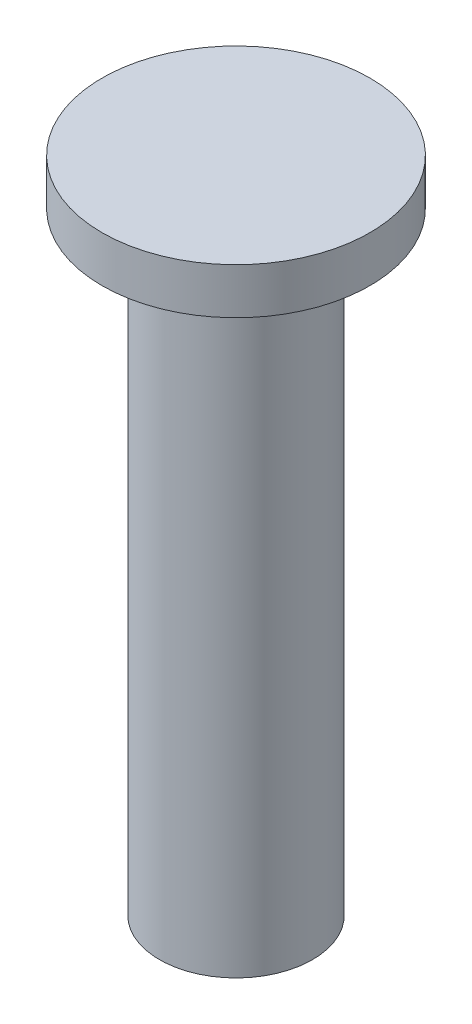
ISO-10303-21;
HEADER;
FILE_DESCRIPTION(('STEP AP214'),'2;1');
FILE_NAME('part.step','',(''),(''),'','','');
FILE_SCHEMA(('AUTOMOTIVE_DESIGN { 1 0 10303 214 1 1 1 1 }'));
ENDSEC;
DATA;
#1=APPLICATION_CONTEXT('core data for automotive mechanical design processes');
#2=APPLICATION_PROTOCOL_DEFINITION('international standard','automotive_design',2000,#1);
#3=PRODUCT_CONTEXT('',#1,'mechanical');
#4=PRODUCT('Part','Part','',(#3));
#5=PRODUCT_RELATED_PRODUCT_CATEGORY('part','',(#4));
#6=PRODUCT_DEFINITION_FORMATION('','',#4);
#7=PRODUCT_DEFINITION_CONTEXT('part definition',#1,'design');
#8=PRODUCT_DEFINITION('design','',#6,#7);
#9=PRODUCT_DEFINITION_SHAPE('','',#8);
#10=(LENGTH_UNIT() NAMED_UNIT(*) SI_UNIT(.MILLI.,.METRE.));
#11=(NAMED_UNIT(*) PLANE_ANGLE_UNIT() SI_UNIT($,.RADIAN.));
#12=(NAMED_UNIT(*) SI_UNIT($,.STERADIAN.) SOLID_ANGLE_UNIT());
#13=UNCERTAINTY_MEASURE_WITH_UNIT(LENGTH_MEASURE(1.E-05),#10,'distance_accuracy_value','');
#14=(GEOMETRIC_REPRESENTATION_CONTEXT(3) GLOBAL_UNCERTAINTY_ASSIGNED_CONTEXT((#13)) GLOBAL_UNIT_ASSIGNED_CONTEXT((#10,
#11,#12)) REPRESENTATION_CONTEXT('',''));
#15=CARTESIAN_POINT('',(0.,0.,0.));
#16=DIRECTION('',(0.,0.,1.));
#17=DIRECTION('',(1.,0.,0.));
#18=AXIS2_PLACEMENT_3D('',#15,#16,#17);
#19=CARTESIAN_POINT('',(0.,1.2,0.));
#20=DIRECTION('',(0.,-1.,0.));
#21=DIRECTION('',(0.,0.,-1.));
#22=AXIS2_PLACEMENT_3D('',#19,#20,#21);
#23=CYLINDRICAL_SURFACE('',#22,3.5);
#24=CARTESIAN_POINT('',(0.,1.2,0.));
#25=DIRECTION('',(0.,1.,0.));
#26=DIRECTION('',(0.,0.,1.));
#27=AXIS2_PLACEMENT_3D('',#24,#25,#26);
#28=CIRCLE('',#27,3.5);
#29=CARTESIAN_POINT('',(0.,1.2,3.5));
#30=VERTEX_POINT('',#29);
#31=EDGE_CURVE('E49',#30,#30,#28,.T.);
#32=ORIENTED_EDGE('',*,*,#31,.F.);
#33=EDGE_LOOP('',(#32));
#34=FACE_BOUND('',#33,.T.);
#35=CARTESIAN_POINT('',(0.,0.,0.));
#36=DIRECTION('',(0.,1.,0.));
#37=DIRECTION('',(0.,0.,1.));
#38=AXIS2_PLACEMENT_3D('',#35,#36,#37);
#39=CIRCLE('',#38,3.5);
#40=CARTESIAN_POINT('',(0.,0.,3.5));
#41=VERTEX_POINT('',#40);
#42=EDGE_CURVE('E44',#41,#41,#39,.T.);
#43=ORIENTED_EDGE('',*,*,#42,.T.);
#44=EDGE_LOOP('',(#43));
#45=FACE_BOUND('',#44,.T.);
#46=ADVANCED_FACE('F41',(#34,#45),#23,.T.);
#47=CARTESIAN_POINT('',(0.,1.2,0.));
#48=DIRECTION('',(0.,1.,0.));
#49=DIRECTION('',(0.,0.,1.));
#50=AXIS2_PLACEMENT_3D('',#47,#48,#49);
#51=PLANE('',#50);
#52=ORIENTED_EDGE('',*,*,#31,.T.);
#53=EDGE_LOOP('',(#52));
#54=FACE_BOUND('',#53,.T.);
#55=ADVANCED_FACE('F69',(#54),#51,.T.);
#56=CARTESIAN_POINT('',(0.,0.,0.));
#57=DIRECTION('',(0.,1.,0.));
#58=DIRECTION('',(0.,0.,1.));
#59=AXIS2_PLACEMENT_3D('',#56,#57,#58);
#60=PLANE('',#59);
#61=CARTESIAN_POINT('',(0.,0.,0.));
#62=DIRECTION('',(0.,-1.,0.));
#63=DIRECTION('',(0.,0.,-1.));
#64=AXIS2_PLACEMENT_3D('',#61,#62,#63);
#65=CIRCLE('',#64,2.);
#66=CARTESIAN_POINT('',(0.,0.,-2.));
#67=VERTEX_POINT('',#66);
#68=EDGE_CURVE('E10',#67,#67,#65,.T.);
#69=ORIENTED_EDGE('',*,*,#68,.F.);
#70=EDGE_LOOP('',(#69));
#71=FACE_BOUND('',#70,.T.);
#72=ORIENTED_EDGE('',*,*,#42,.F.);
#73=EDGE_LOOP('',(#72));
#74=FACE_BOUND('',#73,.T.);
#75=ADVANCED_FACE('F66',(#71,#74),#60,.F.);
#76=CARTESIAN_POINT('',(0.,-16.,0.));
#77=DIRECTION('',(0.,1.,0.));
#78=DIRECTION('',(0.,0.,1.));
#79=AXIS2_PLACEMENT_3D('',#76,#77,#78);
#80=CYLINDRICAL_SURFACE('',#79,2.);
#81=CARTESIAN_POINT('',(0.,-16.,0.));
#82=DIRECTION('',(0.,-1.,0.));
#83=DIRECTION('',(0.,0.,-1.));
#84=AXIS2_PLACEMENT_3D('',#81,#82,#83);
#85=CIRCLE('',#84,2.);
#86=CARTESIAN_POINT('',(0.,-16.,-2.));
#87=VERTEX_POINT('',#86);
#88=EDGE_CURVE('E56',#87,#87,#85,.T.);
#89=ORIENTED_EDGE('',*,*,#88,.F.);
#90=EDGE_LOOP('',(#89));
#91=FACE_BOUND('',#90,.T.);
#92=ORIENTED_EDGE('',*,*,#68,.T.);
#93=EDGE_LOOP('',(#92));
#94=FACE_BOUND('',#93,.T.);
#95=ADVANCED_FACE('F68',(#91,#94),#80,.T.);
#96=CARTESIAN_POINT('',(0.,-16.,0.));
#97=DIRECTION('',(0.,-1.,0.));
#98=DIRECTION('',(0.,0.,-1.));
#99=AXIS2_PLACEMENT_3D('',#96,#97,#98);
#100=PLANE('',#99);
#101=ORIENTED_EDGE('',*,*,#88,.T.);
#102=EDGE_LOOP('',(#101));
#103=FACE_BOUND('',#102,.T.);
#104=ADVANCED_FACE('F75',(#103),#100,.T.);
#105=CLOSED_SHELL('',(#46,#55,#75,#95,#104));
#106=MANIFOLD_SOLID_BREP('B2',#105);
#107=ADVANCED_BREP_SHAPE_REPRESENTATION('',(#18,#106),#14);
#108=SHAPE_DEFINITION_REPRESENTATION(#9,#107);
ENDSEC;
END-ISO-10303-21;
